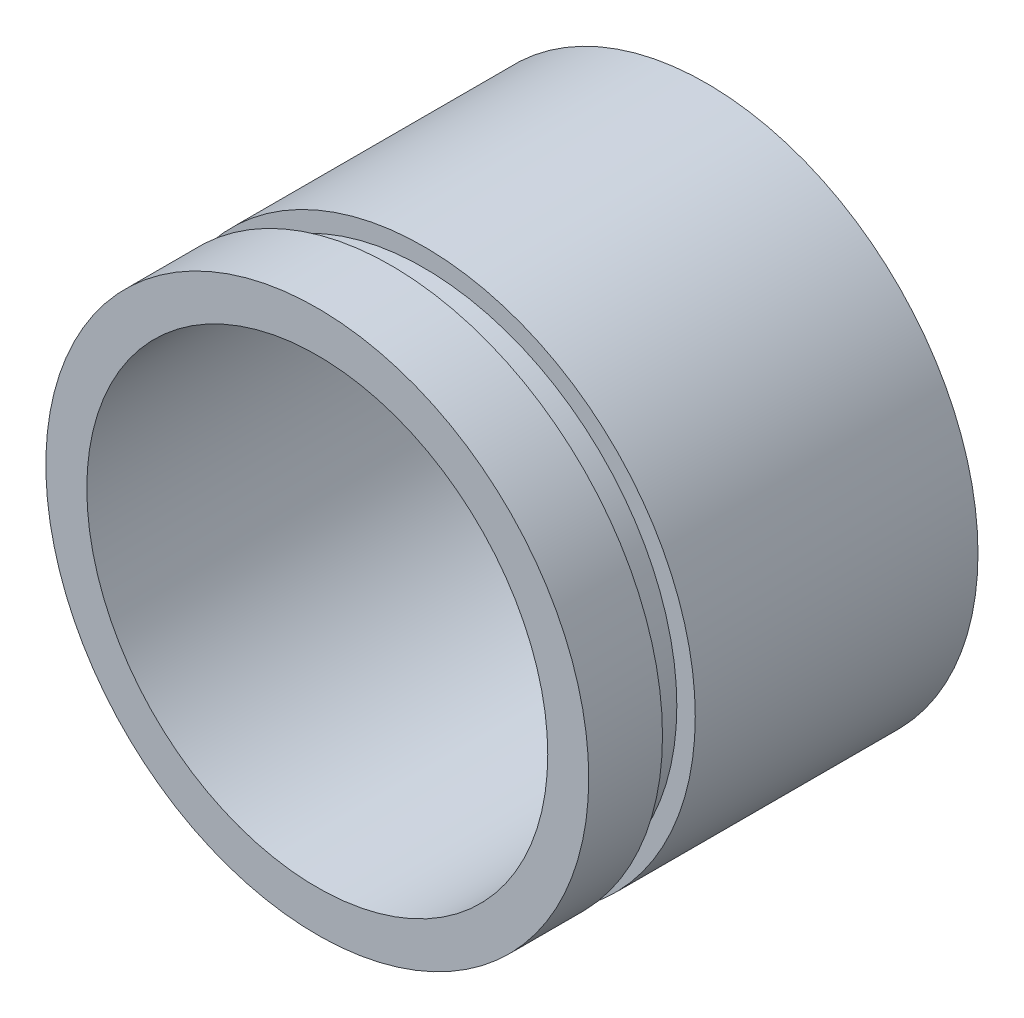
ISO-10303-21;
HEADER;
FILE_DESCRIPTION(('STEP AP214'),'2;1');
FILE_NAME('part.step','',(''),(''),'','','');
FILE_SCHEMA(('AUTOMOTIVE_DESIGN { 1 0 10303 214 1 1 1 1 }'));
ENDSEC;
DATA;
#1=APPLICATION_CONTEXT('core data for automotive mechanical design processes');
#2=APPLICATION_PROTOCOL_DEFINITION('international standard','automotive_design',2000,#1);
#3=PRODUCT_CONTEXT('',#1,'mechanical');
#4=PRODUCT('Part','Part','',(#3));
#5=PRODUCT_RELATED_PRODUCT_CATEGORY('part','',(#4));
#6=PRODUCT_DEFINITION_FORMATION('','',#4);
#7=PRODUCT_DEFINITION_CONTEXT('part definition',#1,'design');
#8=PRODUCT_DEFINITION('design','',#6,#7);
#9=PRODUCT_DEFINITION_SHAPE('','',#8);
#10=(LENGTH_UNIT() NAMED_UNIT(*) SI_UNIT(.MILLI.,.METRE.));
#11=(NAMED_UNIT(*) PLANE_ANGLE_UNIT() SI_UNIT($,.RADIAN.));
#12=(NAMED_UNIT(*) SI_UNIT($,.STERADIAN.) SOLID_ANGLE_UNIT());
#13=UNCERTAINTY_MEASURE_WITH_UNIT(LENGTH_MEASURE(1.E-05),#10,'distance_accuracy_value','');
#14=(GEOMETRIC_REPRESENTATION_CONTEXT(3) GLOBAL_UNCERTAINTY_ASSIGNED_CONTEXT((#13)) GLOBAL_UNIT_ASSIGNED_CONTEXT((#10,
#11,#12)) REPRESENTATION_CONTEXT('',''));
#15=CARTESIAN_POINT('',(0.,0.,0.));
#16=DIRECTION('',(0.,0.,1.));
#17=DIRECTION('',(1.,0.,0.));
#18=AXIS2_PLACEMENT_3D('',#15,#16,#17);
#19=CARTESIAN_POINT('',(0.,0.,19.));
#20=DIRECTION('',(0.,0.,-1.));
#21=DIRECTION('',(-1.,0.,0.));
#22=AXIS2_PLACEMENT_3D('',#19,#20,#21);
#23=CYLINDRICAL_SURFACE('',#22,26.5);
#24=CARTESIAN_POINT('',(0.,0.,11.8));
#25=DIRECTION('',(0.,0.,1.));
#26=DIRECTION('',(1.,0.,0.));
#27=AXIS2_PLACEMENT_3D('',#24,#25,#26);
#28=CIRCLE('',#27,26.5);
#29=CARTESIAN_POINT('',(26.5,0.,11.8));
#30=VERTEX_POINT('',#29);
#31=EDGE_CURVE('E74',#30,#30,#28,.T.);
#32=ORIENTED_EDGE('',*,*,#31,.T.);
#33=EDGE_LOOP('',(#32));
#34=FACE_BOUND('',#33,.T.);
#35=CARTESIAN_POINT('',(0.,0.,19.));
#36=DIRECTION('',(0.,0.,1.));
#37=DIRECTION('',(1.,0.,0.));
#38=AXIS2_PLACEMENT_3D('',#35,#36,#37);
#39=CIRCLE('',#38,26.5);
#40=CARTESIAN_POINT('',(26.5,0.,19.));
#41=VERTEX_POINT('',#40);
#42=EDGE_CURVE('E12',#41,#41,#39,.T.);
#43=ORIENTED_EDGE('',*,*,#42,.F.);
#44=EDGE_LOOP('',(#43));
#45=FACE_BOUND('',#44,.T.);
#46=ADVANCED_FACE('F51',(#34,#45),#23,.T.);
#47=CARTESIAN_POINT('',(0.,0.,19.));
#48=DIRECTION('',(0.,0.,1.));
#49=DIRECTION('',(1.,0.,0.));
#50=AXIS2_PLACEMENT_3D('',#47,#48,#49);
#51=PLANE('',#50);
#52=CARTESIAN_POINT('',(0.,0.,19.));
#53=DIRECTION('',(0.,0.,1.));
#54=DIRECTION('',(1.,0.,0.));
#55=AXIS2_PLACEMENT_3D('',#52,#53,#54);
#56=CIRCLE('',#55,22.5);
#57=CARTESIAN_POINT('',(22.5,0.,19.));
#58=VERTEX_POINT('',#57);
#59=EDGE_CURVE('E61',#58,#58,#56,.T.);
#60=ORIENTED_EDGE('',*,*,#59,.F.);
#61=EDGE_LOOP('',(#60));
#62=FACE_BOUND('',#61,.T.);
#63=ORIENTED_EDGE('',*,*,#42,.T.);
#64=EDGE_LOOP('',(#63));
#65=FACE_BOUND('',#64,.T.);
#66=ADVANCED_FACE('F111',(#62,#65),#51,.T.);
#67=CARTESIAN_POINT('',(0.,0.,19.));
#68=DIRECTION('',(0.,0.,-1.));
#69=DIRECTION('',(-1.,0.,0.));
#70=AXIS2_PLACEMENT_3D('',#67,#68,#69);
#71=CYLINDRICAL_SURFACE('',#70,22.5);
#72=ORIENTED_EDGE('',*,*,#59,.T.);
#73=EDGE_LOOP('',(#72));
#74=FACE_BOUND('',#73,.T.);
#75=CARTESIAN_POINT('',(0.,0.,-15.));
#76=DIRECTION('',(0.,0.,1.));
#77=DIRECTION('',(1.,0.,0.));
#78=AXIS2_PLACEMENT_3D('',#75,#76,#77);
#79=CIRCLE('',#78,22.5);
#80=CARTESIAN_POINT('',(22.5,0.,-15.));
#81=VERTEX_POINT('',#80);
#82=EDGE_CURVE('E65',#81,#81,#79,.T.);
#83=ORIENTED_EDGE('',*,*,#82,.F.);
#84=EDGE_LOOP('',(#83));
#85=FACE_BOUND('',#84,.T.);
#86=ADVANCED_FACE('F116',(#74,#85),#71,.F.);
#87=CARTESIAN_POINT('',(0.,0.,-15.));
#88=DIRECTION('',(0.,0.,1.));
#89=DIRECTION('',(1.,0.,0.));
#90=AXIS2_PLACEMENT_3D('',#87,#88,#89);
#91=PLANE('',#90);
#92=ORIENTED_EDGE('',*,*,#82,.T.);
#93=EDGE_LOOP('',(#92));
#94=FACE_BOUND('',#93,.T.);
#95=ADVANCED_FACE('F87',(#94),#91,.T.);
#96=CARTESIAN_POINT('',(0.,0.,19.));
#97=DIRECTION('',(0.,0.,1.));
#98=DIRECTION('',(1.,0.,0.));
#99=AXIS2_PLACEMENT_3D('',#96,#97,#98);
#100=CYLINDRICAL_SURFACE('',#99,24.7);
#101=CARTESIAN_POINT('',(0.,0.,11.8));
#102=DIRECTION('',(0.,0.,1.));
#103=DIRECTION('',(1.,0.,0.));
#104=AXIS2_PLACEMENT_3D('',#101,#102,#103);
#105=CIRCLE('',#104,24.7);
#106=CARTESIAN_POINT('',(24.7,0.,11.8));
#107=VERTEX_POINT('',#106);
#108=EDGE_CURVE('E77',#107,#107,#105,.T.);
#109=ORIENTED_EDGE('',*,*,#108,.F.);
#110=EDGE_LOOP('',(#109));
#111=FACE_BOUND('',#110,.T.);
#112=CARTESIAN_POINT('',(0.,0.,8.6));
#113=DIRECTION('',(0.,0.,1.));
#114=DIRECTION('',(1.,0.,0.));
#115=AXIS2_PLACEMENT_3D('',#112,#113,#114);
#116=CIRCLE('',#115,24.7);
#117=CARTESIAN_POINT('',(24.7,0.,8.6));
#118=VERTEX_POINT('',#117);
#119=EDGE_CURVE('E68',#118,#118,#116,.T.);
#120=ORIENTED_EDGE('',*,*,#119,.T.);
#121=EDGE_LOOP('',(#120));
#122=FACE_BOUND('',#121,.T.);
#123=ADVANCED_FACE('F83',(#111,#122),#100,.T.);
#124=CARTESIAN_POINT('',(24.7,0.,8.6));
#125=DIRECTION('',(0.,0.,-1.));
#126=DIRECTION('',(-1.,0.,0.));
#127=AXIS2_PLACEMENT_3D('',#124,#125,#126);
#128=PLANE('',#127);
#129=ORIENTED_EDGE('',*,*,#119,.F.);
#130=EDGE_LOOP('',(#129));
#131=FACE_BOUND('',#130,.T.);
#132=CARTESIAN_POINT('',(0.,0.,8.6));
#133=DIRECTION('',(0.,0.,1.));
#134=DIRECTION('',(1.,0.,0.));
#135=AXIS2_PLACEMENT_3D('',#132,#133,#134);
#136=CIRCLE('',#135,26.5);
#137=CARTESIAN_POINT('',(26.5,0.,8.6));
#138=VERTEX_POINT('',#137);
#139=EDGE_CURVE('E71',#138,#138,#136,.T.);
#140=ORIENTED_EDGE('',*,*,#139,.T.);
#141=EDGE_LOOP('',(#140));
#142=FACE_BOUND('',#141,.T.);
#143=ADVANCED_FACE('F86',(#131,#142),#128,.F.);
#144=CARTESIAN_POINT('',(24.7,0.,11.8));
#145=DIRECTION('',(0.,0.,1.));
#146=DIRECTION('',(1.,0.,0.));
#147=AXIS2_PLACEMENT_3D('',#144,#145,#146);
#148=PLANE('',#147);
#149=ORIENTED_EDGE('',*,*,#31,.F.);
#150=EDGE_LOOP('',(#149));
#151=FACE_BOUND('',#150,.T.);
#152=ORIENTED_EDGE('',*,*,#108,.T.);
#153=EDGE_LOOP('',(#152));
#154=FACE_BOUND('',#153,.T.);
#155=ADVANCED_FACE('F81',(#151,#154),#148,.F.);
#156=CARTESIAN_POINT('',(0.,0.,-19.));
#157=DIRECTION('',(0.,0.,1.));
#158=DIRECTION('',(1.,0.,0.));
#159=AXIS2_PLACEMENT_3D('',#156,#157,#158);
#160=PLANE('',#159);
#161=CARTESIAN_POINT('',(0.,0.,-19.));
#162=DIRECTION('',(0.,0.,1.));
#163=DIRECTION('',(1.,0.,0.));
#164=AXIS2_PLACEMENT_3D('',#161,#162,#163);
#165=CIRCLE('',#164,26.5);
#166=CARTESIAN_POINT('',(26.5,0.,-19.));
#167=VERTEX_POINT('',#166);
#168=EDGE_CURVE('E54',#167,#167,#165,.T.);
#169=ORIENTED_EDGE('',*,*,#168,.F.);
#170=EDGE_LOOP('',(#169));
#171=FACE_BOUND('',#170,.T.);
#172=ADVANCED_FACE('F99',(#171),#160,.F.);
#173=ORIENTED_EDGE('',*,*,#139,.F.);
#174=EDGE_LOOP('',(#173));
#175=FACE_BOUND('',#174,.T.);
#176=ORIENTED_EDGE('',*,*,#168,.T.);
#177=EDGE_LOOP('',(#176));
#178=FACE_BOUND('',#177,.T.);
#179=ADVANCED_FACE('F96',(#175,#178),#23,.T.);
#180=CLOSED_SHELL('',(#46,#66,#86,#95,#123,#143,#155,#172,#179));
#181=MANIFOLD_SOLID_BREP('B2',#180);
#182=ADVANCED_BREP_SHAPE_REPRESENTATION('',(#18,#181),#14);
#183=SHAPE_DEFINITION_REPRESENTATION(#9,#182);
ENDSEC;
END-ISO-10303-21;
